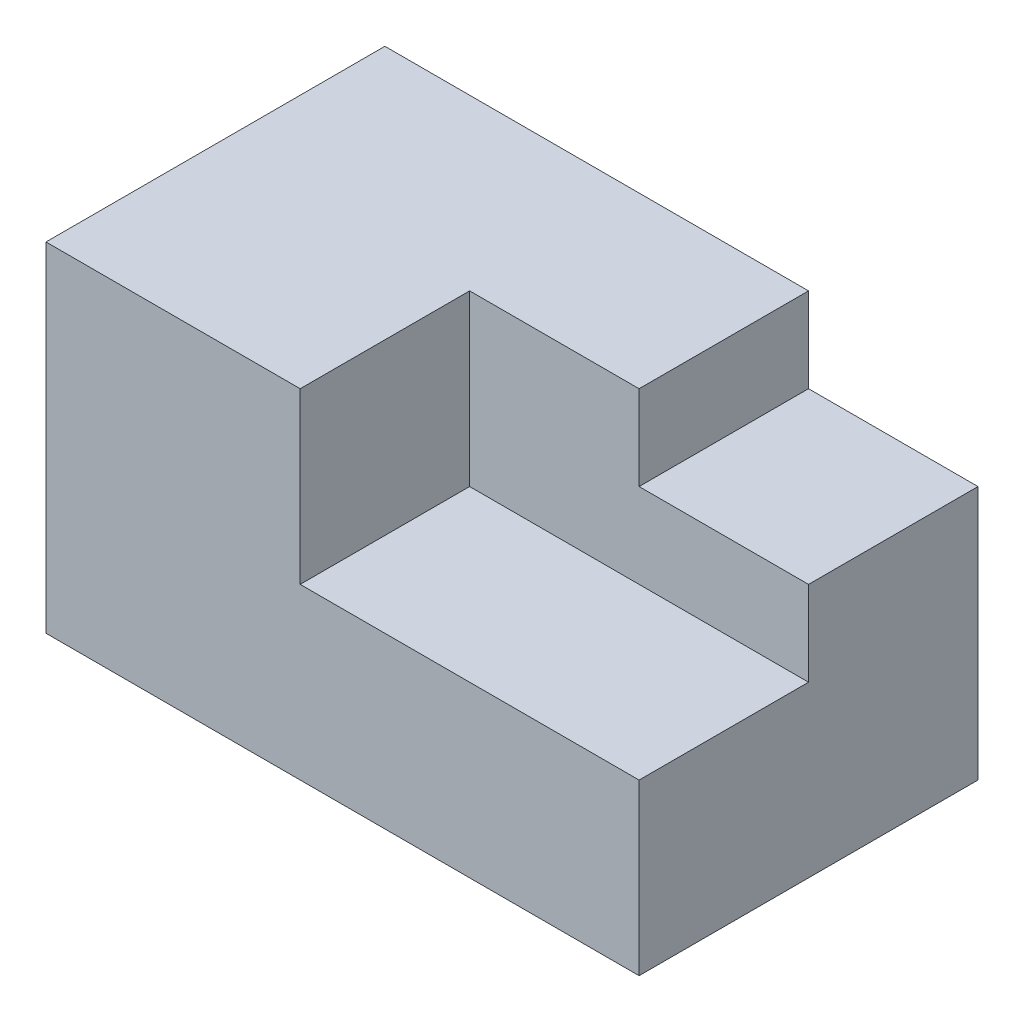
ISO-10303-21;
HEADER;
FILE_DESCRIPTION(('STEP AP214'),'2;1');
FILE_NAME('part.step','',(''),(''),'','','');
FILE_SCHEMA(('AUTOMOTIVE_DESIGN { 1 0 10303 214 1 1 1 1 }'));
ENDSEC;
DATA;
#1=APPLICATION_CONTEXT('core data for automotive mechanical design processes');
#2=APPLICATION_PROTOCOL_DEFINITION('international standard','automotive_design',2000,#1);
#3=PRODUCT_CONTEXT('',#1,'mechanical');
#4=PRODUCT('Part','Part','',(#3));
#5=PRODUCT_RELATED_PRODUCT_CATEGORY('part','',(#4));
#6=PRODUCT_DEFINITION_FORMATION('','',#4);
#7=PRODUCT_DEFINITION_CONTEXT('part definition',#1,'design');
#8=PRODUCT_DEFINITION('design','',#6,#7);
#9=PRODUCT_DEFINITION_SHAPE('','',#8);
#10=(LENGTH_UNIT() NAMED_UNIT(*) SI_UNIT(.MILLI.,.METRE.));
#11=(NAMED_UNIT(*) PLANE_ANGLE_UNIT() SI_UNIT($,.RADIAN.));
#12=(NAMED_UNIT(*) SI_UNIT($,.STERADIAN.) SOLID_ANGLE_UNIT());
#13=UNCERTAINTY_MEASURE_WITH_UNIT(LENGTH_MEASURE(1.E-05),#10,'distance_accuracy_value','');
#14=(GEOMETRIC_REPRESENTATION_CONTEXT(3) GLOBAL_UNCERTAINTY_ASSIGNED_CONTEXT((#13)) GLOBAL_UNIT_ASSIGNED_CONTEXT((#10,
#11,#12)) REPRESENTATION_CONTEXT('',''));
#15=CARTESIAN_POINT('',(0.,0.,0.));
#16=DIRECTION('',(0.,0.,1.));
#17=DIRECTION('',(1.,0.,0.));
#18=AXIS2_PLACEMENT_3D('',#15,#16,#17);
#19=CARTESIAN_POINT('',(0.,40.,0.));
#20=DIRECTION('',(1.,0.,0.));
#21=DIRECTION('',(0.,0.,-1.));
#22=AXIS2_PLACEMENT_3D('',#19,#20,#21);
#23=PLANE('',#22);
#24=DIRECTION('',(0.,0.,1.));
#25=VECTOR('',#24,1.);
#26=CARTESIAN_POINT('',(0.,0.,0.));
#27=LINE('',#26,#25);
#28=CARTESIAN_POINT('',(0.,0.,-40.));
#29=VERTEX_POINT('',#28);
#30=CARTESIAN_POINT('',(0.,0.,0.));
#31=VERTEX_POINT('',#30);
#32=EDGE_CURVE('E92',#29,#31,#27,.T.);
#33=ORIENTED_EDGE('',*,*,#32,.T.);
#34=DIRECTION('',(0.,-1.,0.));
#35=VECTOR('',#34,1.);
#36=CARTESIAN_POINT('',(0.,40.,0.));
#37=LINE('',#36,#35);
#38=CARTESIAN_POINT('',(0.,40.,0.));
#39=VERTEX_POINT('',#38);
#40=EDGE_CURVE('E11',#39,#31,#37,.T.);
#41=ORIENTED_EDGE('',*,*,#40,.F.);
#42=DIRECTION('',(0.,0.,1.));
#43=VECTOR('',#42,1.);
#44=CARTESIAN_POINT('',(0.,40.,0.));
#45=LINE('',#44,#43);
#46=CARTESIAN_POINT('',(0.,40.,-40.));
#47=VERTEX_POINT('',#46);
#48=EDGE_CURVE('E86',#47,#39,#45,.T.);
#49=ORIENTED_EDGE('',*,*,#48,.F.);
#50=DIRECTION('',(0.,-1.,0.));
#51=VECTOR('',#50,1.);
#52=CARTESIAN_POINT('',(0.,40.,-40.));
#53=LINE('',#52,#51);
#54=EDGE_CURVE('E77',#47,#29,#53,.T.);
#55=ORIENTED_EDGE('',*,*,#54,.T.);
#56=EDGE_LOOP('',(#33,#41,#49,#55));
#57=FACE_BOUND('',#56,.T.);
#58=ADVANCED_FACE('F33',(#57),#23,.F.);
#59=CARTESIAN_POINT('',(0.,40.,0.));
#60=DIRECTION('',(0.,0.,-1.));
#61=DIRECTION('',(-1.,0.,0.));
#62=AXIS2_PLACEMENT_3D('',#59,#60,#61);
#63=PLANE('',#62);
#64=DIRECTION('',(1.,0.,0.));
#65=VECTOR('',#64,1.);
#66=CARTESIAN_POINT('',(70.,20.,0.));
#67=LINE('',#66,#65);
#68=CARTESIAN_POINT('',(30.,20.,0.));
#69=VERTEX_POINT('',#68);
#70=CARTESIAN_POINT('',(70.,20.,0.));
#71=VERTEX_POINT('',#70);
#72=EDGE_CURVE('E147',#69,#71,#67,.T.);
#73=ORIENTED_EDGE('',*,*,#72,.F.);
#74=DIRECTION('',(0.,1.,0.));
#75=VECTOR('',#74,1.);
#76=CARTESIAN_POINT('',(30.,20.,0.));
#77=LINE('',#76,#75);
#78=CARTESIAN_POINT('',(30.,40.,0.));
#79=VERTEX_POINT('',#78);
#80=EDGE_CURVE('E123',#69,#79,#77,.T.);
#81=ORIENTED_EDGE('',*,*,#80,.T.);
#82=DIRECTION('',(1.,0.,0.));
#83=VECTOR('',#82,1.);
#84=CARTESIAN_POINT('',(0.,40.,0.));
#85=LINE('',#84,#83);
#86=EDGE_CURVE('E120',#39,#79,#85,.T.);
#87=ORIENTED_EDGE('',*,*,#86,.F.);
#88=ORIENTED_EDGE('',*,*,#40,.T.);
#89=DIRECTION('',(1.,0.,0.));
#90=VECTOR('',#89,1.);
#91=CARTESIAN_POINT('',(0.,0.,0.));
#92=LINE('',#91,#90);
#93=CARTESIAN_POINT('',(70.,0.,0.));
#94=VERTEX_POINT('',#93);
#95=EDGE_CURVE('E96',#31,#94,#92,.T.);
#96=ORIENTED_EDGE('',*,*,#95,.T.);
#97=DIRECTION('',(0.,-1.,0.));
#98=VECTOR('',#97,1.);
#99=CARTESIAN_POINT('',(70.,40.,0.));
#100=LINE('',#99,#98);
#101=EDGE_CURVE('E40',#71,#94,#100,.T.);
#102=ORIENTED_EDGE('',*,*,#101,.F.);
#103=EDGE_LOOP('',(#73,#81,#87,#88,#96,#102));
#104=FACE_BOUND('',#103,.T.);
#105=ADVANCED_FACE('F117',(#104),#63,.F.);
#106=CARTESIAN_POINT('',(70.,40.,0.));
#107=DIRECTION('',(-1.,0.,0.));
#108=DIRECTION('',(0.,0.,1.));
#109=AXIS2_PLACEMENT_3D('',#106,#107,#108);
#110=PLANE('',#109);
#111=DIRECTION('',(0.,0.,-1.));
#112=VECTOR('',#111,1.);
#113=CARTESIAN_POINT('',(70.,30.,-40.));
#114=LINE('',#113,#112);
#115=CARTESIAN_POINT('',(70.,30.,-20.));
#116=VERTEX_POINT('',#115);
#117=CARTESIAN_POINT('',(70.,30.,-40.));
#118=VERTEX_POINT('',#117);
#119=EDGE_CURVE('E132',#116,#118,#114,.T.);
#120=ORIENTED_EDGE('',*,*,#119,.F.);
#121=DIRECTION('',(0.,1.,0.));
#122=VECTOR('',#121,1.);
#123=CARTESIAN_POINT('',(70.,20.,-20.));
#124=LINE('',#123,#122);
#125=CARTESIAN_POINT('',(70.,20.,-20.));
#126=VERTEX_POINT('',#125);
#127=EDGE_CURVE('E143',#126,#116,#124,.T.);
#128=ORIENTED_EDGE('',*,*,#127,.F.);
#129=DIRECTION('',(0.,0.,-1.));
#130=VECTOR('',#129,1.);
#131=CARTESIAN_POINT('',(70.,20.,0.));
#132=LINE('',#131,#130);
#133=EDGE_CURVE('E114',#71,#126,#132,.T.);
#134=ORIENTED_EDGE('',*,*,#133,.F.);
#135=ORIENTED_EDGE('',*,*,#101,.T.);
#136=DIRECTION('',(0.,0.,-1.));
#137=VECTOR('',#136,1.);
#138=CARTESIAN_POINT('',(70.,0.,0.));
#139=LINE('',#138,#137);
#140=CARTESIAN_POINT('',(70.,0.,-40.));
#141=VERTEX_POINT('',#140);
#142=EDGE_CURVE('E87',#94,#141,#139,.T.);
#143=ORIENTED_EDGE('',*,*,#142,.T.);
#144=DIRECTION('',(0.,-1.,0.));
#145=VECTOR('',#144,1.);
#146=CARTESIAN_POINT('',(70.,40.,-40.));
#147=LINE('',#146,#145);
#148=EDGE_CURVE('E81',#118,#141,#147,.T.);
#149=ORIENTED_EDGE('',*,*,#148,.F.);
#150=EDGE_LOOP('',(#120,#128,#134,#135,#143,#149));
#151=FACE_BOUND('',#150,.T.);
#152=ADVANCED_FACE('F110',(#151),#110,.F.);
#153=CARTESIAN_POINT('',(0.,40.,-40.));
#154=DIRECTION('',(0.,0.,1.));
#155=DIRECTION('',(1.,0.,0.));
#156=AXIS2_PLACEMENT_3D('',#153,#154,#155);
#157=PLANE('',#156);
#158=DIRECTION('',(-1.,0.,0.));
#159=VECTOR('',#158,1.);
#160=CARTESIAN_POINT('',(0.,40.,-40.));
#161=LINE('',#160,#159);
#162=CARTESIAN_POINT('',(50.,40.,-40.));
#163=VERTEX_POINT('',#162);
#164=EDGE_CURVE('E55',#163,#47,#161,.T.);
#165=ORIENTED_EDGE('',*,*,#164,.F.);
#166=DIRECTION('',(0.,1.,0.));
#167=VECTOR('',#166,1.);
#168=CARTESIAN_POINT('',(50.,30.,-40.));
#169=LINE('',#168,#167);
#170=CARTESIAN_POINT('',(50.,30.,-40.));
#171=VERTEX_POINT('',#170);
#172=EDGE_CURVE('E47',#171,#163,#169,.T.);
#173=ORIENTED_EDGE('',*,*,#172,.F.);
#174=DIRECTION('',(-1.,0.,0.));
#175=VECTOR('',#174,1.);
#176=CARTESIAN_POINT('',(70.,30.,-40.));
#177=LINE('',#176,#175);
#178=EDGE_CURVE('E138',#118,#171,#177,.T.);
#179=ORIENTED_EDGE('',*,*,#178,.F.);
#180=ORIENTED_EDGE('',*,*,#148,.T.);
#181=DIRECTION('',(-1.,0.,0.));
#182=VECTOR('',#181,1.);
#183=CARTESIAN_POINT('',(0.,0.,-40.));
#184=LINE('',#183,#182);
#185=EDGE_CURVE('E74',#141,#29,#184,.T.);
#186=ORIENTED_EDGE('',*,*,#185,.T.);
#187=ORIENTED_EDGE('',*,*,#54,.F.);
#188=EDGE_LOOP('',(#165,#173,#179,#180,#186,#187));
#189=FACE_BOUND('',#188,.T.);
#190=ADVANCED_FACE('F76',(#189),#157,.F.);
#191=CARTESIAN_POINT('',(0.,40.,0.));
#192=DIRECTION('',(0.,-1.,0.));
#193=DIRECTION('',(0.,0.,-1.));
#194=AXIS2_PLACEMENT_3D('',#191,#192,#193);
#195=PLANE('',#194);
#196=ORIENTED_EDGE('',*,*,#86,.T.);
#197=DIRECTION('',(0.,0.,1.));
#198=VECTOR('',#197,1.);
#199=CARTESIAN_POINT('',(30.,40.,0.));
#200=LINE('',#199,#198);
#201=CARTESIAN_POINT('',(30.,40.,-20.));
#202=VERTEX_POINT('',#201);
#203=EDGE_CURVE('E151',#202,#79,#200,.T.);
#204=ORIENTED_EDGE('',*,*,#203,.F.);
#205=DIRECTION('',(-1.,0.,0.));
#206=VECTOR('',#205,1.);
#207=CARTESIAN_POINT('',(70.,40.,-20.));
#208=LINE('',#207,#206);
#209=CARTESIAN_POINT('',(50.,40.,-20.));
#210=VERTEX_POINT('',#209);
#211=EDGE_CURVE('E154',#210,#202,#208,.T.);
#212=ORIENTED_EDGE('',*,*,#211,.F.);
#213=DIRECTION('',(0.,0.,1.));
#214=VECTOR('',#213,1.);
#215=CARTESIAN_POINT('',(50.,40.,-40.));
#216=LINE('',#215,#214);
#217=EDGE_CURVE('E130',#163,#210,#216,.T.);
#218=ORIENTED_EDGE('',*,*,#217,.F.);
#219=ORIENTED_EDGE('',*,*,#164,.T.);
#220=ORIENTED_EDGE('',*,*,#48,.T.);
#221=EDGE_LOOP('',(#196,#204,#212,#218,#219,#220));
#222=FACE_BOUND('',#221,.T.);
#223=ADVANCED_FACE('F125',(#222),#195,.F.);
#224=CARTESIAN_POINT('',(0.,0.,0.));
#225=DIRECTION('',(0.,-1.,0.));
#226=DIRECTION('',(0.,0.,-1.));
#227=AXIS2_PLACEMENT_3D('',#224,#225,#226);
#228=PLANE('',#227);
#229=ORIENTED_EDGE('',*,*,#32,.F.);
#230=ORIENTED_EDGE('',*,*,#185,.F.);
#231=ORIENTED_EDGE('',*,*,#142,.F.);
#232=ORIENTED_EDGE('',*,*,#95,.F.);
#233=EDGE_LOOP('',(#229,#230,#231,#232));
#234=FACE_BOUND('',#233,.T.);
#235=ADVANCED_FACE('F94',(#234),#228,.T.);
#236=CARTESIAN_POINT('',(50.,30.,-40.));
#237=DIRECTION('',(-1.,0.,0.));
#238=DIRECTION('',(0.,0.,1.));
#239=AXIS2_PLACEMENT_3D('',#236,#237,#238);
#240=PLANE('',#239);
#241=ORIENTED_EDGE('',*,*,#217,.T.);
#242=DIRECTION('',(0.,1.,0.));
#243=VECTOR('',#242,1.);
#244=CARTESIAN_POINT('',(50.,30.,-20.));
#245=LINE('',#244,#243);
#246=CARTESIAN_POINT('',(50.,30.,-20.));
#247=VERTEX_POINT('',#246);
#248=EDGE_CURVE('E97',#247,#210,#245,.T.);
#249=ORIENTED_EDGE('',*,*,#248,.F.);
#250=DIRECTION('',(0.,0.,1.));
#251=VECTOR('',#250,1.);
#252=CARTESIAN_POINT('',(50.,30.,-40.));
#253=LINE('',#252,#251);
#254=EDGE_CURVE('E135',#171,#247,#253,.T.);
#255=ORIENTED_EDGE('',*,*,#254,.F.);
#256=ORIENTED_EDGE('',*,*,#172,.T.);
#257=EDGE_LOOP('',(#241,#249,#255,#256));
#258=FACE_BOUND('',#257,.T.);
#259=ADVANCED_FACE('F183',(#258),#240,.F.);
#260=CARTESIAN_POINT('',(0.,30.,0.));
#261=DIRECTION('',(0.,-1.,0.));
#262=DIRECTION('',(0.,0.,-1.));
#263=AXIS2_PLACEMENT_3D('',#260,#261,#262);
#264=PLANE('',#263);
#265=ORIENTED_EDGE('',*,*,#119,.T.);
#266=ORIENTED_EDGE('',*,*,#178,.T.);
#267=ORIENTED_EDGE('',*,*,#254,.T.);
#268=DIRECTION('',(1.,0.,0.));
#269=VECTOR('',#268,1.);
#270=CARTESIAN_POINT('',(70.,30.,-20.));
#271=LINE('',#270,#269);
#272=EDGE_CURVE('E128',#247,#116,#271,.T.);
#273=ORIENTED_EDGE('',*,*,#272,.T.);
#274=EDGE_LOOP('',(#265,#266,#267,#273));
#275=FACE_BOUND('',#274,.T.);
#276=ADVANCED_FACE('F179',(#275),#264,.F.);
#277=CARTESIAN_POINT('',(70.,20.,-20.));
#278=DIRECTION('',(0.,0.,-1.));
#279=DIRECTION('',(-1.,0.,0.));
#280=AXIS2_PLACEMENT_3D('',#277,#278,#279);
#281=PLANE('',#280);
#282=ORIENTED_EDGE('',*,*,#211,.T.);
#283=DIRECTION('',(0.,1.,0.));
#284=VECTOR('',#283,1.);
#285=CARTESIAN_POINT('',(30.,20.,-20.));
#286=LINE('',#285,#284);
#287=CARTESIAN_POINT('',(30.,20.,-20.));
#288=VERTEX_POINT('',#287);
#289=EDGE_CURVE('E146',#288,#202,#286,.T.);
#290=ORIENTED_EDGE('',*,*,#289,.F.);
#291=DIRECTION('',(-1.,0.,0.));
#292=VECTOR('',#291,1.);
#293=CARTESIAN_POINT('',(70.,20.,-20.));
#294=LINE('',#293,#292);
#295=EDGE_CURVE('E162',#126,#288,#294,.T.);
#296=ORIENTED_EDGE('',*,*,#295,.F.);
#297=ORIENTED_EDGE('',*,*,#127,.T.);
#298=ORIENTED_EDGE('',*,*,#272,.F.);
#299=ORIENTED_EDGE('',*,*,#248,.T.);
#300=EDGE_LOOP('',(#282,#290,#296,#297,#298,#299));
#301=FACE_BOUND('',#300,.T.);
#302=ADVANCED_FACE('F173',(#301),#281,.F.);
#303=CARTESIAN_POINT('',(30.,20.,0.));
#304=DIRECTION('',(-1.,0.,0.));
#305=DIRECTION('',(0.,0.,1.));
#306=AXIS2_PLACEMENT_3D('',#303,#304,#305);
#307=PLANE('',#306);
#308=ORIENTED_EDGE('',*,*,#203,.T.);
#309=ORIENTED_EDGE('',*,*,#80,.F.);
#310=DIRECTION('',(0.,0.,1.));
#311=VECTOR('',#310,1.);
#312=CARTESIAN_POINT('',(30.,20.,0.));
#313=LINE('',#312,#311);
#314=EDGE_CURVE('E159',#288,#69,#313,.T.);
#315=ORIENTED_EDGE('',*,*,#314,.F.);
#316=ORIENTED_EDGE('',*,*,#289,.T.);
#317=EDGE_LOOP('',(#308,#309,#315,#316));
#318=FACE_BOUND('',#317,.T.);
#319=ADVANCED_FACE('F197',(#318),#307,.F.);
#320=CARTESIAN_POINT('',(0.,20.,0.));
#321=DIRECTION('',(0.,1.,0.));
#322=DIRECTION('',(0.,0.,1.));
#323=AXIS2_PLACEMENT_3D('',#320,#321,#322);
#324=PLANE('',#323);
#325=ORIENTED_EDGE('',*,*,#133,.T.);
#326=ORIENTED_EDGE('',*,*,#295,.T.);
#327=ORIENTED_EDGE('',*,*,#314,.T.);
#328=ORIENTED_EDGE('',*,*,#72,.T.);
#329=EDGE_LOOP('',(#325,#326,#327,#328));
#330=FACE_BOUND('',#329,.T.);
#331=ADVANCED_FACE('F167',(#330),#324,.T.);
#332=CLOSED_SHELL('',(#58,#105,#152,#190,#223,#235,#259,#276,#302,#319,#331));
#333=MANIFOLD_SOLID_BREP('B2',#332);
#334=ADVANCED_BREP_SHAPE_REPRESENTATION('',(#18,#333),#14);
#335=SHAPE_DEFINITION_REPRESENTATION(#9,#334);
ENDSEC;
END-ISO-10303-21;
